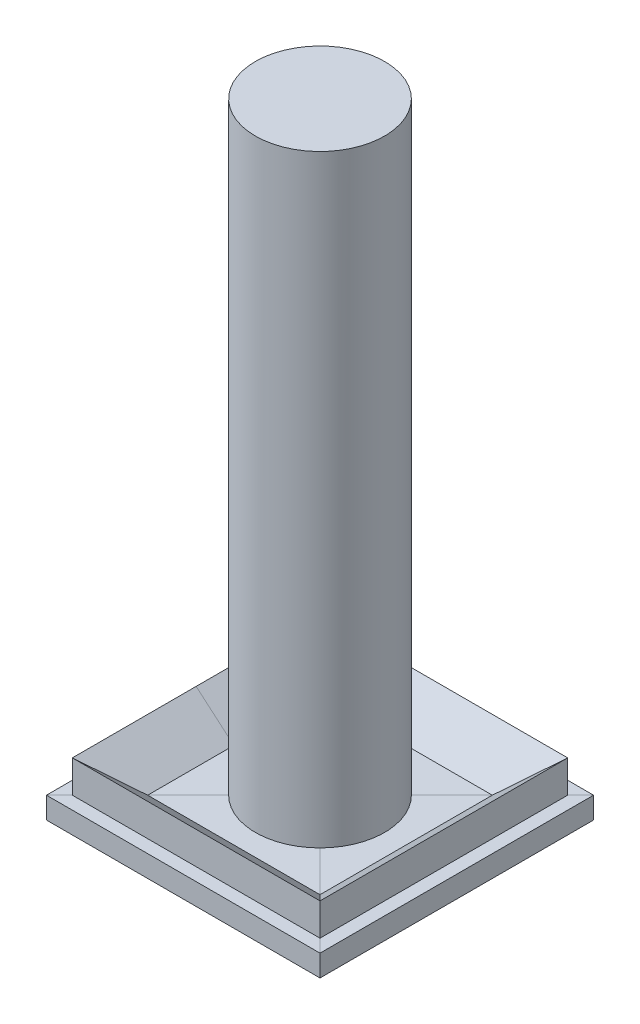
ISO-10303-21;
HEADER;
FILE_DESCRIPTION(('STEP AP214'),'2;1');
FILE_NAME('part.step','',(''),(''),'','','');
FILE_SCHEMA(('AUTOMOTIVE_DESIGN { 1 0 10303 214 1 1 1 1 }'));
ENDSEC;
DATA;
#1=APPLICATION_CONTEXT('core data for automotive mechanical design processes');
#2=APPLICATION_PROTOCOL_DEFINITION('international standard','automotive_design',2000,#1);
#3=PRODUCT_CONTEXT('',#1,'mechanical');
#4=PRODUCT('Part','Part','',(#3));
#5=PRODUCT_RELATED_PRODUCT_CATEGORY('part','',(#4));
#6=PRODUCT_DEFINITION_FORMATION('','',#4);
#7=PRODUCT_DEFINITION_CONTEXT('part definition',#1,'design');
#8=PRODUCT_DEFINITION('design','',#6,#7);
#9=PRODUCT_DEFINITION_SHAPE('','',#8);
#10=(LENGTH_UNIT() NAMED_UNIT(*) SI_UNIT(.MILLI.,.METRE.));
#11=(NAMED_UNIT(*) PLANE_ANGLE_UNIT() SI_UNIT($,.RADIAN.));
#12=(NAMED_UNIT(*) SI_UNIT($,.STERADIAN.) SOLID_ANGLE_UNIT());
#13=UNCERTAINTY_MEASURE_WITH_UNIT(LENGTH_MEASURE(1.E-05),#10,'distance_accuracy_value','');
#14=(GEOMETRIC_REPRESENTATION_CONTEXT(3) GLOBAL_UNCERTAINTY_ASSIGNED_CONTEXT((#13)) GLOBAL_UNIT_ASSIGNED_CONTEXT((#10,
#11,#12)) REPRESENTATION_CONTEXT('',''));
#15=CARTESIAN_POINT('',(0.,0.,0.));
#16=DIRECTION('',(0.,0.,1.));
#17=DIRECTION('',(1.,0.,0.));
#18=AXIS2_PLACEMENT_3D('',#15,#16,#17);
#19=CARTESIAN_POINT('',(12.7,0.,12.7));
#20=DIRECTION('',(0.,1.,0.));
#21=DIRECTION('',(0.,0.,1.));
#22=AXIS2_PLACEMENT_3D('',#19,#20,#21);
#23=PLANE('',#22);
#24=DIRECTION('',(-1.,0.,0.));
#25=VECTOR('',#24,1.);
#26=CARTESIAN_POINT('',(12.7,0.,12.7));
#27=LINE('',#26,#25);
#28=CARTESIAN_POINT('',(12.7,0.,12.7));
#29=VERTEX_POINT('',#28);
#30=CARTESIAN_POINT('',(-12.7,0.,12.7));
#31=VERTEX_POINT('',#30);
#32=EDGE_CURVE('E293',#29,#31,#27,.T.);
#33=ORIENTED_EDGE('',*,*,#32,.T.);
#34=DIRECTION('',(-0.707106781186547,0.,0.707106781186548));
#35=VECTOR('',#34,1.);
#36=CARTESIAN_POINT('',(-12.7,0.,12.7));
#37=LINE('',#36,#35);
#38=CARTESIAN_POINT('',(0.,0.,0.));
#39=VERTEX_POINT('',#38);
#40=EDGE_CURVE('E257',#39,#31,#37,.T.);
#41=ORIENTED_EDGE('',*,*,#40,.F.);
#42=DIRECTION('',(0.707106781186548,0.,0.707106781186547));
#43=VECTOR('',#42,1.);
#44=CARTESIAN_POINT('',(0.,0.,0.));
#45=LINE('',#44,#43);
#46=EDGE_CURVE('E207',#39,#29,#45,.T.);
#47=ORIENTED_EDGE('',*,*,#46,.T.);
#48=EDGE_LOOP('',(#33,#41,#47));
#49=FACE_BOUND('',#48,.T.);
#50=ADVANCED_FACE('F37',(#49),#23,.F.);
#51=CARTESIAN_POINT('',(12.7,0.,12.7));
#52=DIRECTION('',(0.,0.,-1.));
#53=DIRECTION('',(-1.,0.,0.));
#54=AXIS2_PLACEMENT_3D('',#51,#52,#53);
#55=PLANE('',#54);
#56=DIRECTION('',(0.,-1.,0.));
#57=VECTOR('',#56,1.);
#58=CARTESIAN_POINT('',(-12.7,0.,12.7));
#59=LINE('',#58,#57);
#60=CARTESIAN_POINT('',(-12.7,2.,12.7));
#61=VERTEX_POINT('',#60);
#62=EDGE_CURVE('E272',#61,#31,#59,.T.);
#63=ORIENTED_EDGE('',*,*,#62,.T.);
#64=ORIENTED_EDGE('',*,*,#32,.F.);
#65=DIRECTION('',(0.,-1.,0.));
#66=VECTOR('',#65,1.);
#67=CARTESIAN_POINT('',(12.7,0.,12.7));
#68=LINE('',#67,#66);
#69=CARTESIAN_POINT('',(12.7,2.,12.7));
#70=VERTEX_POINT('',#69);
#71=EDGE_CURVE('E228',#70,#29,#68,.T.);
#72=ORIENTED_EDGE('',*,*,#71,.F.);
#73=DIRECTION('',(-1.,0.,0.));
#74=VECTOR('',#73,1.);
#75=CARTESIAN_POINT('',(12.7,2.,12.7));
#76=LINE('',#75,#74);
#77=EDGE_CURVE('E177',#70,#61,#76,.T.);
#78=ORIENTED_EDGE('',*,*,#77,.T.);
#79=EDGE_LOOP('',(#63,#64,#72,#78));
#80=FACE_BOUND('',#79,.T.);
#81=ADVANCED_FACE('F417',(#80),#55,.F.);
#82=CARTESIAN_POINT('',(12.7,2.,12.7));
#83=DIRECTION('',(0.,-1.,0.));
#84=DIRECTION('',(0.,0.,-1.));
#85=AXIS2_PLACEMENT_3D('',#82,#83,#84);
#86=PLANE('',#85);
#87=ORIENTED_EDGE('',*,*,#77,.F.);
#88=DIRECTION('',(-0.707106781186548,0.,-0.707106781186547));
#89=VECTOR('',#88,1.);
#90=CARTESIAN_POINT('',(0.,2.,0.));
#91=LINE('',#90,#89);
#92=CARTESIAN_POINT('',(11.5,2.,11.5));
#93=VERTEX_POINT('',#92);
#94=EDGE_CURVE('E225',#70,#93,#91,.T.);
#95=ORIENTED_EDGE('',*,*,#94,.T.);
#96=DIRECTION('',(-1.,0.,0.));
#97=VECTOR('',#96,1.);
#98=CARTESIAN_POINT('',(12.7,2.,11.5));
#99=LINE('',#98,#97);
#100=CARTESIAN_POINT('',(-11.5,2.,11.5));
#101=VERTEX_POINT('',#100);
#102=EDGE_CURVE('E305',#93,#101,#99,.T.);
#103=ORIENTED_EDGE('',*,*,#102,.T.);
#104=DIRECTION('',(0.707106781186547,0.,-0.707106781186548));
#105=VECTOR('',#104,1.);
#106=CARTESIAN_POINT('',(-12.7,2.,12.7));
#107=LINE('',#106,#105);
#108=EDGE_CURVE('E232',#61,#101,#107,.T.);
#109=ORIENTED_EDGE('',*,*,#108,.F.);
#110=EDGE_LOOP('',(#87,#95,#103,#109));
#111=FACE_BOUND('',#110,.T.);
#112=ADVANCED_FACE('F39',(#111),#86,.F.);
#113=CARTESIAN_POINT('',(12.7,2.,11.5));
#114=DIRECTION('',(0.,0.,-1.));
#115=DIRECTION('',(0.,1.,0.));
#116=AXIS2_PLACEMENT_3D('',#113,#114,#115);
#117=PLANE('',#116);
#118=ORIENTED_EDGE('',*,*,#102,.F.);
#119=DIRECTION('',(0.,1.,0.));
#120=VECTOR('',#119,1.);
#121=CARTESIAN_POINT('',(11.5,2.00000000000003,11.5));
#122=LINE('',#121,#120);
#123=CARTESIAN_POINT('',(11.5,5.,11.5));
#124=VERTEX_POINT('',#123);
#125=EDGE_CURVE('E222',#93,#124,#122,.T.);
#126=ORIENTED_EDGE('',*,*,#125,.T.);
#127=DIRECTION('',(-1.,0.,0.));
#128=VECTOR('',#127,1.);
#129=CARTESIAN_POINT('',(12.7,5.,11.5));
#130=LINE('',#129,#128);
#131=CARTESIAN_POINT('',(-11.5,5.,11.5));
#132=VERTEX_POINT('',#131);
#133=EDGE_CURVE('E311',#124,#132,#130,.T.);
#134=ORIENTED_EDGE('',*,*,#133,.T.);
#135=DIRECTION('',(0.,1.,0.));
#136=VECTOR('',#135,1.);
#137=CARTESIAN_POINT('',(-11.5,2.,11.5));
#138=LINE('',#137,#136);
#139=EDGE_CURVE('E264',#101,#132,#138,.T.);
#140=ORIENTED_EDGE('',*,*,#139,.F.);
#141=EDGE_LOOP('',(#118,#126,#134,#140));
#142=FACE_BOUND('',#141,.T.);
#143=ADVANCED_FACE('F343',(#142),#117,.F.);
#144=CARTESIAN_POINT('',(12.7,5.,11.5));
#145=DIRECTION('',(0.,-0.759256602365297,0.650791373455968));
#146=DIRECTION('',(0.,-0.650791373455968,-0.759256602365297));
#147=AXIS2_PLACEMENT_3D('',#144,#145,#146);
#148=PLANE('',#147);
#149=ORIENTED_EDGE('',*,*,#133,.F.);
#150=DIRECTION('',(-0.604707897906952,-0.518321055348816,-0.604707897906952));
#151=VECTOR('',#150,1.);
#152=CARTESIAN_POINT('',(2.65074626865671,-2.58507462686567,2.65074626865671));
#153=LINE('',#152,#151);
#154=CARTESIAN_POINT('',(8.,2.,7.99999999999999));
#155=VERTEX_POINT('',#154);
#156=EDGE_CURVE('E218',#124,#155,#153,.T.);
#157=ORIENTED_EDGE('',*,*,#156,.T.);
#158=DIRECTION('',(-1.,0.,0.));
#159=VECTOR('',#158,1.);
#160=CARTESIAN_POINT('',(12.7,2.,7.99999999999999));
#161=LINE('',#160,#159);
#162=CARTESIAN_POINT('',(-8.,2.,8.));
#163=VERTEX_POINT('',#162);
#164=EDGE_CURVE('E308',#155,#163,#161,.T.);
#165=ORIENTED_EDGE('',*,*,#164,.T.);
#166=DIRECTION('',(0.604707897906952,-0.518321055348816,-0.604707897906952));
#167=VECTOR('',#166,1.);
#168=CARTESIAN_POINT('',(-11.9388059701493,5.37611940298507,11.9388059701493));
#169=LINE('',#168,#167);
#170=EDGE_CURVE('E262',#132,#163,#169,.T.);
#171=ORIENTED_EDGE('',*,*,#170,.F.);
#172=EDGE_LOOP('',(#149,#157,#165,#171));
#173=FACE_BOUND('',#172,.T.);
#174=ADVANCED_FACE('F318',(#173),#148,.F.);
#175=CARTESIAN_POINT('',(12.7,2.,7.99999999999999));
#176=DIRECTION('',(0.,-1.,0.));
#177=DIRECTION('',(0.,0.,-1.));
#178=AXIS2_PLACEMENT_3D('',#175,#176,#177);
#179=PLANE('',#178);
#180=CARTESIAN_POINT('',(0.,2.,0.));
#181=DIRECTION('',(0.,-1.,0.));
#182=DIRECTION('',(0.,0.,-1.));
#183=AXIS2_PLACEMENT_3D('',#180,#181,#182);
#184=CIRCLE('',#183,6.);
#185=CARTESIAN_POINT('',(-4.24264068711929,2.,4.24264068711928));
#186=VERTEX_POINT('',#185);
#187=CARTESIAN_POINT('',(4.24264068711929,2.,4.24264068711928));
#188=VERTEX_POINT('',#187);
#189=EDGE_CURVE('E52',#186,#188,#184,.F.);
#190=ORIENTED_EDGE('',*,*,#189,.F.);
#191=DIRECTION('',(0.707106781186547,0.,-0.707106781186548));
#192=VECTOR('',#191,1.);
#193=CARTESIAN_POINT('',(-10.35,2.,10.35));
#194=LINE('',#193,#192);
#195=EDGE_CURVE('E259',#163,#186,#194,.T.);
#196=ORIENTED_EDGE('',*,*,#195,.F.);
#197=ORIENTED_EDGE('',*,*,#164,.F.);
#198=DIRECTION('',(-0.707106781186548,0.,-0.707106781186547));
#199=VECTOR('',#198,1.);
#200=CARTESIAN_POINT('',(-2.35,2.,-2.35));
#201=LINE('',#200,#199);
#202=EDGE_CURVE('E216',#155,#188,#201,.T.);
#203=ORIENTED_EDGE('',*,*,#202,.T.);
#204=EDGE_LOOP('',(#190,#196,#197,#203));
#205=FACE_BOUND('',#204,.T.);
#206=ADVANCED_FACE('F321',(#205),#179,.F.);
#207=CARTESIAN_POINT('',(-12.7,0.,12.7));
#208=DIRECTION('',(0.,1.,0.));
#209=DIRECTION('',(0.,0.,1.));
#210=AXIS2_PLACEMENT_3D('',#207,#208,#209);
#211=PLANE('',#210);
#212=DIRECTION('',(1.,0.,0.));
#213=VECTOR('',#212,1.);
#214=CARTESIAN_POINT('',(-12.7,0.,0.));
#215=LINE('',#214,#213);
#216=CARTESIAN_POINT('',(-12.7,0.,0.));
#217=VERTEX_POINT('',#216);
#218=EDGE_CURVE('E267',#217,#39,#215,.T.);
#219=ORIENTED_EDGE('',*,*,#218,.T.);
#220=ORIENTED_EDGE('',*,*,#40,.T.);
#221=DIRECTION('',(0.,0.,-1.));
#222=VECTOR('',#221,1.);
#223=CARTESIAN_POINT('',(-12.7,0.,12.7));
#224=LINE('',#223,#222);
#225=EDGE_CURVE('E269',#31,#217,#224,.T.);
#226=ORIENTED_EDGE('',*,*,#225,.T.);
#227=EDGE_LOOP('',(#219,#220,#226));
#228=FACE_BOUND('',#227,.T.);
#229=ADVANCED_FACE('F421',(#228),#211,.F.);
#230=CARTESIAN_POINT('',(-8.,2.,12.7));
#231=DIRECTION('',(0.,-1.,0.));
#232=DIRECTION('',(1.,0.,0.));
#233=AXIS2_PLACEMENT_3D('',#230,#231,#232);
#234=PLANE('',#233);
#235=CARTESIAN_POINT('',(0.,2.,0.));
#236=DIRECTION('',(0.,-1.,0.));
#237=DIRECTION('',(1.,0.,0.));
#238=AXIS2_PLACEMENT_3D('',#235,#236,#237);
#239=CIRCLE('',#238,6.);
#240=CARTESIAN_POINT('',(-6.,2.,0.));
#241=VERTEX_POINT('',#240);
#242=EDGE_CURVE('E59',#241,#186,#239,.F.);
#243=ORIENTED_EDGE('',*,*,#242,.F.);
#244=DIRECTION('',(-1.,0.,0.));
#245=VECTOR('',#244,1.);
#246=CARTESIAN_POINT('',(-8.,2.,0.));
#247=LINE('',#246,#245);
#248=CARTESIAN_POINT('',(-8.,2.,0.));
#249=VERTEX_POINT('',#248);
#250=EDGE_CURVE('E163',#241,#249,#247,.T.);
#251=ORIENTED_EDGE('',*,*,#250,.T.);
#252=DIRECTION('',(0.,0.,-1.));
#253=VECTOR('',#252,1.);
#254=CARTESIAN_POINT('',(-8.,2.,12.7));
#255=LINE('',#254,#253);
#256=EDGE_CURVE('E247',#163,#249,#255,.T.);
#257=ORIENTED_EDGE('',*,*,#256,.F.);
#258=ORIENTED_EDGE('',*,*,#195,.T.);
#259=EDGE_LOOP('',(#243,#251,#257,#258));
#260=FACE_BOUND('',#259,.T.);
#261=ADVANCED_FACE('F322',(#260),#234,.F.);
#262=CARTESIAN_POINT('',(-11.5,5.,12.7));
#263=DIRECTION('',(-0.650791373455968,-0.759256602365297,0.));
#264=DIRECTION('',(0.759256602365297,-0.650791373455968,0.));
#265=AXIS2_PLACEMENT_3D('',#262,#263,#264);
#266=PLANE('',#265);
#267=ORIENTED_EDGE('',*,*,#170,.T.);
#268=ORIENTED_EDGE('',*,*,#256,.T.);
#269=DIRECTION('',(-0.759256602365297,0.650791373455968,0.));
#270=VECTOR('',#269,1.);
#271=CARTESIAN_POINT('',(-11.5,5.,0.));
#272=LINE('',#271,#270);
#273=CARTESIAN_POINT('',(-11.5,5.,0.));
#274=VERTEX_POINT('',#273);
#275=EDGE_CURVE('E250',#249,#274,#272,.T.);
#276=ORIENTED_EDGE('',*,*,#275,.T.);
#277=DIRECTION('',(0.,0.,-1.));
#278=VECTOR('',#277,1.);
#279=CARTESIAN_POINT('',(-11.5,5.,12.7));
#280=LINE('',#279,#278);
#281=EDGE_CURVE('E251',#132,#274,#280,.T.);
#282=ORIENTED_EDGE('',*,*,#281,.F.);
#283=EDGE_LOOP('',(#267,#268,#276,#282));
#284=FACE_BOUND('',#283,.T.);
#285=ADVANCED_FACE('F324',(#284),#266,.F.);
#286=CARTESIAN_POINT('',(-11.5,2.,12.7));
#287=DIRECTION('',(1.,0.,0.));
#288=DIRECTION('',(0.,1.,0.));
#289=AXIS2_PLACEMENT_3D('',#286,#287,#288);
#290=PLANE('',#289);
#291=ORIENTED_EDGE('',*,*,#139,.T.);
#292=ORIENTED_EDGE('',*,*,#281,.T.);
#293=DIRECTION('',(0.,-1.,0.));
#294=VECTOR('',#293,1.);
#295=CARTESIAN_POINT('',(-11.5,2.,0.));
#296=LINE('',#295,#294);
#297=CARTESIAN_POINT('',(-11.5,2.,0.));
#298=VERTEX_POINT('',#297);
#299=EDGE_CURVE('E253',#274,#298,#296,.T.);
#300=ORIENTED_EDGE('',*,*,#299,.T.);
#301=DIRECTION('',(0.,0.,-1.));
#302=VECTOR('',#301,1.);
#303=CARTESIAN_POINT('',(-11.5,2.,12.7));
#304=LINE('',#303,#302);
#305=EDGE_CURVE('E254',#101,#298,#304,.T.);
#306=ORIENTED_EDGE('',*,*,#305,.F.);
#307=EDGE_LOOP('',(#291,#292,#300,#306));
#308=FACE_BOUND('',#307,.T.);
#309=ADVANCED_FACE('F339',(#308),#290,.F.);
#310=CARTESIAN_POINT('',(-12.7,2.,12.7));
#311=DIRECTION('',(0.,-1.,0.));
#312=DIRECTION('',(0.,0.,-1.));
#313=AXIS2_PLACEMENT_3D('',#310,#311,#312);
#314=PLANE('',#313);
#315=ORIENTED_EDGE('',*,*,#108,.T.);
#316=ORIENTED_EDGE('',*,*,#305,.T.);
#317=DIRECTION('',(-1.,0.,0.));
#318=VECTOR('',#317,1.);
#319=CARTESIAN_POINT('',(-12.7,2.,0.));
#320=LINE('',#319,#318);
#321=CARTESIAN_POINT('',(-12.7,2.,0.));
#322=VERTEX_POINT('',#321);
#323=EDGE_CURVE('E256',#298,#322,#320,.T.);
#324=ORIENTED_EDGE('',*,*,#323,.T.);
#325=DIRECTION('',(0.,0.,-1.));
#326=VECTOR('',#325,1.);
#327=CARTESIAN_POINT('',(-12.7,2.,12.7));
#328=LINE('',#327,#326);
#329=EDGE_CURVE('E285',#61,#322,#328,.T.);
#330=ORIENTED_EDGE('',*,*,#329,.F.);
#331=EDGE_LOOP('',(#315,#316,#324,#330));
#332=FACE_BOUND('',#331,.T.);
#333=ADVANCED_FACE('F540',(#332),#314,.F.);
#334=CARTESIAN_POINT('',(-12.7,0.,12.7));
#335=DIRECTION('',(1.,0.,0.));
#336=DIRECTION('',(0.,0.,-1.));
#337=AXIS2_PLACEMENT_3D('',#334,#335,#336);
#338=PLANE('',#337);
#339=DIRECTION('',(0.,-1.,0.));
#340=VECTOR('',#339,1.);
#341=CARTESIAN_POINT('',(-12.7,0.,0.));
#342=LINE('',#341,#340);
#343=EDGE_CURVE('E277',#322,#217,#342,.T.);
#344=ORIENTED_EDGE('',*,*,#343,.T.);
#345=ORIENTED_EDGE('',*,*,#225,.F.);
#346=ORIENTED_EDGE('',*,*,#62,.F.);
#347=ORIENTED_EDGE('',*,*,#329,.T.);
#348=EDGE_LOOP('',(#344,#345,#346,#347));
#349=FACE_BOUND('',#348,.T.);
#350=ADVANCED_FACE('F534',(#349),#338,.F.);
#351=CARTESIAN_POINT('',(-12.7,0.,0.));
#352=DIRECTION('',(1.,0.,0.));
#353=DIRECTION('',(0.,0.,-1.));
#354=AXIS2_PLACEMENT_3D('',#351,#352,#353);
#355=PLANE('',#354);
#356=DIRECTION('',(0.,-1.,0.));
#357=VECTOR('',#356,1.);
#358=CARTESIAN_POINT('',(-12.7,0.,-12.7));
#359=LINE('',#358,#357);
#360=CARTESIAN_POINT('',(-12.7,2.,-12.7));
#361=VERTEX_POINT('',#360);
#362=CARTESIAN_POINT('',(-12.7,0.,-12.7));
#363=VERTEX_POINT('',#362);
#364=EDGE_CURVE('E194',#361,#363,#359,.T.);
#365=ORIENTED_EDGE('',*,*,#364,.T.);
#366=DIRECTION('',(0.,0.,-1.));
#367=VECTOR('',#366,1.);
#368=CARTESIAN_POINT('',(-12.7,0.,0.));
#369=LINE('',#368,#367);
#370=EDGE_CURVE('E273',#217,#363,#369,.T.);
#371=ORIENTED_EDGE('',*,*,#370,.F.);
#372=ORIENTED_EDGE('',*,*,#343,.F.);
#373=DIRECTION('',(0.,0.,-1.));
#374=VECTOR('',#373,1.);
#375=CARTESIAN_POINT('',(-12.7,2.,0.));
#376=LINE('',#375,#374);
#377=EDGE_CURVE('E260',#322,#361,#376,.T.);
#378=ORIENTED_EDGE('',*,*,#377,.T.);
#379=EDGE_LOOP('',(#365,#371,#372,#378));
#380=FACE_BOUND('',#379,.T.);
#381=ADVANCED_FACE('F427',(#380),#355,.F.);
#382=CARTESIAN_POINT('',(-12.7,0.,0.));
#383=DIRECTION('',(0.,1.,0.));
#384=DIRECTION('',(0.,0.,1.));
#385=AXIS2_PLACEMENT_3D('',#382,#383,#384);
#386=PLANE('',#385);
#387=ORIENTED_EDGE('',*,*,#370,.T.);
#388=DIRECTION('',(-0.707106781186548,0.,-0.707106781186547));
#389=VECTOR('',#388,1.);
#390=CARTESIAN_POINT('',(-12.7,0.,-12.7));
#391=LINE('',#390,#389);
#392=EDGE_CURVE('E157',#39,#363,#391,.T.);
#393=ORIENTED_EDGE('',*,*,#392,.F.);
#394=ORIENTED_EDGE('',*,*,#218,.F.);
#395=EDGE_LOOP('',(#387,#393,#394));
#396=FACE_BOUND('',#395,.T.);
#397=ADVANCED_FACE('F424',(#396),#386,.F.);
#398=CARTESIAN_POINT('',(-8.,2.,0.));
#399=DIRECTION('',(0.,-1.,0.));
#400=DIRECTION('',(1.,0.,0.));
#401=AXIS2_PLACEMENT_3D('',#398,#399,#400);
#402=PLANE('',#401);
#403=CARTESIAN_POINT('',(0.,2.,0.));
#404=DIRECTION('',(0.,-1.,0.));
#405=DIRECTION('',(1.,0.,0.));
#406=AXIS2_PLACEMENT_3D('',#403,#404,#405);
#407=CIRCLE('',#406,6.);
#408=CARTESIAN_POINT('',(-4.24264068711928,2.,-4.24264068711929));
#409=VERTEX_POINT('',#408);
#410=EDGE_CURVE('E161',#409,#241,#407,.F.);
#411=ORIENTED_EDGE('',*,*,#410,.F.);
#412=DIRECTION('',(0.707106781186548,0.,0.707106781186547));
#413=VECTOR('',#412,1.);
#414=CARTESIAN_POINT('',(-10.35,2.,-10.35));
#415=LINE('',#414,#413);
#416=CARTESIAN_POINT('',(-8.,2.,-8.));
#417=VERTEX_POINT('',#416);
#418=EDGE_CURVE('E149',#417,#409,#415,.T.);
#419=ORIENTED_EDGE('',*,*,#418,.F.);
#420=DIRECTION('',(0.,0.,-1.));
#421=VECTOR('',#420,1.);
#422=CARTESIAN_POINT('',(-8.,2.,0.));
#423=LINE('',#422,#421);
#424=EDGE_CURVE('E276',#249,#417,#423,.T.);
#425=ORIENTED_EDGE('',*,*,#424,.F.);
#426=ORIENTED_EDGE('',*,*,#250,.F.);
#427=EDGE_LOOP('',(#411,#419,#425,#426));
#428=FACE_BOUND('',#427,.T.);
#429=ADVANCED_FACE('F162',(#428),#402,.F.);
#430=CARTESIAN_POINT('',(-11.5,5.,0.));
#431=DIRECTION('',(-0.650791373455968,-0.759256602365297,0.));
#432=DIRECTION('',(0.759256602365297,-0.650791373455968,0.));
#433=AXIS2_PLACEMENT_3D('',#430,#431,#432);
#434=PLANE('',#433);
#435=DIRECTION('',(0.,0.,-1.));
#436=VECTOR('',#435,1.);
#437=CARTESIAN_POINT('',(-11.5,5.,0.));
#438=LINE('',#437,#436);
#439=CARTESIAN_POINT('',(-11.5,5.,-11.5));
#440=VERTEX_POINT('',#439);
#441=EDGE_CURVE('E298',#274,#440,#438,.T.);
#442=ORIENTED_EDGE('',*,*,#441,.F.);
#443=ORIENTED_EDGE('',*,*,#275,.F.);
#444=ORIENTED_EDGE('',*,*,#424,.T.);
#445=DIRECTION('',(0.604707897906952,-0.518321055348816,0.604707897906952));
#446=VECTOR('',#445,1.);
#447=CARTESIAN_POINT('',(-11.9388059701493,5.37611940298507,-11.9388059701493));
#448=LINE('',#447,#446);
#449=EDGE_CURVE('E158',#440,#417,#448,.T.);
#450=ORIENTED_EDGE('',*,*,#449,.F.);
#451=EDGE_LOOP('',(#442,#443,#444,#450));
#452=FACE_BOUND('',#451,.T.);
#453=ADVANCED_FACE('F329',(#452),#434,.F.);
#454=CARTESIAN_POINT('',(-11.5,2.,0.));
#455=DIRECTION('',(1.,0.,0.));
#456=DIRECTION('',(0.,1.,0.));
#457=AXIS2_PLACEMENT_3D('',#454,#455,#456);
#458=PLANE('',#457);
#459=DIRECTION('',(0.,0.,-1.));
#460=VECTOR('',#459,1.);
#461=CARTESIAN_POINT('',(-11.5,2.,0.));
#462=LINE('',#461,#460);
#463=CARTESIAN_POINT('',(-11.5,2.,-11.5));
#464=VERTEX_POINT('',#463);
#465=EDGE_CURVE('E290',#298,#464,#462,.T.);
#466=ORIENTED_EDGE('',*,*,#465,.F.);
#467=ORIENTED_EDGE('',*,*,#299,.F.);
#468=ORIENTED_EDGE('',*,*,#441,.T.);
#469=DIRECTION('',(0.,1.,0.));
#470=VECTOR('',#469,1.);
#471=CARTESIAN_POINT('',(-11.5,2.,-11.5));
#472=LINE('',#471,#470);
#473=EDGE_CURVE('E206',#464,#440,#472,.T.);
#474=ORIENTED_EDGE('',*,*,#473,.F.);
#475=EDGE_LOOP('',(#466,#467,#468,#474));
#476=FACE_BOUND('',#475,.T.);
#477=ADVANCED_FACE('F335',(#476),#458,.F.);
#478=CARTESIAN_POINT('',(-12.7,2.,0.));
#479=DIRECTION('',(0.,-1.,0.));
#480=DIRECTION('',(0.,0.,-1.));
#481=AXIS2_PLACEMENT_3D('',#478,#479,#480);
#482=PLANE('',#481);
#483=ORIENTED_EDGE('',*,*,#377,.F.);
#484=ORIENTED_EDGE('',*,*,#323,.F.);
#485=ORIENTED_EDGE('',*,*,#465,.T.);
#486=DIRECTION('',(0.707106781186548,0.,0.707106781186547));
#487=VECTOR('',#486,1.);
#488=CARTESIAN_POINT('',(-12.7,2.,-12.7));
#489=LINE('',#488,#487);
#490=EDGE_CURVE('E204',#361,#464,#489,.T.);
#491=ORIENTED_EDGE('',*,*,#490,.F.);
#492=EDGE_LOOP('',(#483,#484,#485,#491));
#493=FACE_BOUND('',#492,.T.);
#494=ADVANCED_FACE('F390',(#493),#482,.F.);
#495=CARTESIAN_POINT('',(12.7,0.,-12.7));
#496=DIRECTION('',(0.,1.,0.));
#497=DIRECTION('',(0.,0.,1.));
#498=AXIS2_PLACEMENT_3D('',#495,#496,#497);
#499=PLANE('',#498);
#500=DIRECTION('',(0.,0.,1.));
#501=VECTOR('',#500,1.);
#502=CARTESIAN_POINT('',(12.7,0.,-12.7));
#503=LINE('',#502,#501);
#504=CARTESIAN_POINT('',(12.7,0.,-12.7));
#505=VERTEX_POINT('',#504);
#506=EDGE_CURVE('E219',#505,#29,#503,.T.);
#507=ORIENTED_EDGE('',*,*,#506,.T.);
#508=ORIENTED_EDGE('',*,*,#46,.F.);
#509=DIRECTION('',(0.707106781186547,0.,-0.707106781186548));
#510=VECTOR('',#509,1.);
#511=CARTESIAN_POINT('',(0.,0.,0.));
#512=LINE('',#511,#510);
#513=EDGE_CURVE('E178',#39,#505,#512,.T.);
#514=ORIENTED_EDGE('',*,*,#513,.T.);
#515=EDGE_LOOP('',(#507,#508,#514));
#516=FACE_BOUND('',#515,.T.);
#517=ADVANCED_FACE('F388',(#516),#499,.F.);
#518=CARTESIAN_POINT('',(12.7,0.,-12.7));
#519=DIRECTION('',(-1.,0.,0.));
#520=DIRECTION('',(0.,0.,1.));
#521=AXIS2_PLACEMENT_3D('',#518,#519,#520);
#522=PLANE('',#521);
#523=ORIENTED_EDGE('',*,*,#71,.T.);
#524=ORIENTED_EDGE('',*,*,#506,.F.);
#525=DIRECTION('',(0.,-1.,0.));
#526=VECTOR('',#525,1.);
#527=CARTESIAN_POINT('',(12.7,0.,-12.7));
#528=LINE('',#527,#526);
#529=CARTESIAN_POINT('',(12.7,2.,-12.7));
#530=VERTEX_POINT('',#529);
#531=EDGE_CURVE('E181',#530,#505,#528,.T.);
#532=ORIENTED_EDGE('',*,*,#531,.F.);
#533=DIRECTION('',(0.,0.,1.));
#534=VECTOR('',#533,1.);
#535=CARTESIAN_POINT('',(12.7,2.,-12.7));
#536=LINE('',#535,#534);
#537=EDGE_CURVE('E231',#530,#70,#536,.T.);
#538=ORIENTED_EDGE('',*,*,#537,.T.);
#539=EDGE_LOOP('',(#523,#524,#532,#538));
#540=FACE_BOUND('',#539,.T.);
#541=ADVANCED_FACE('F385',(#540),#522,.F.);
#542=CARTESIAN_POINT('',(12.7,2.,-12.7));
#543=DIRECTION('',(0.,-1.,0.));
#544=DIRECTION('',(0.,0.,-1.));
#545=AXIS2_PLACEMENT_3D('',#542,#543,#544);
#546=PLANE('',#545);
#547=ORIENTED_EDGE('',*,*,#537,.F.);
#548=DIRECTION('',(-0.707106781186547,0.,0.707106781186548));
#549=VECTOR('',#548,1.);
#550=CARTESIAN_POINT('',(0.,2.,0.));
#551=LINE('',#550,#549);
#552=CARTESIAN_POINT('',(11.5,2.,-11.5));
#553=VERTEX_POINT('',#552);
#554=EDGE_CURVE('E45',#530,#553,#551,.T.);
#555=ORIENTED_EDGE('',*,*,#554,.T.);
#556=DIRECTION('',(0.,0.,1.));
#557=VECTOR('',#556,1.);
#558=CARTESIAN_POINT('',(11.5,2.,-12.7));
#559=LINE('',#558,#557);
#560=EDGE_CURVE('E235',#553,#93,#559,.T.);
#561=ORIENTED_EDGE('',*,*,#560,.T.);
#562=ORIENTED_EDGE('',*,*,#94,.F.);
#563=EDGE_LOOP('',(#547,#555,#561,#562));
#564=FACE_BOUND('',#563,.T.);
#565=ADVANCED_FACE('F387',(#564),#546,.F.);
#566=CARTESIAN_POINT('',(11.5,2.,-12.7));
#567=DIRECTION('',(-1.,0.,0.));
#568=DIRECTION('',(0.,-1.,0.));
#569=AXIS2_PLACEMENT_3D('',#566,#567,#568);
#570=PLANE('',#569);
#571=ORIENTED_EDGE('',*,*,#560,.F.);
#572=DIRECTION('',(0.,1.,0.));
#573=VECTOR('',#572,1.);
#574=CARTESIAN_POINT('',(11.5,2.00000000000003,-11.5));
#575=LINE('',#574,#573);
#576=CARTESIAN_POINT('',(11.5,5.,-11.5));
#577=VERTEX_POINT('',#576);
#578=EDGE_CURVE('E186',#553,#577,#575,.T.);
#579=ORIENTED_EDGE('',*,*,#578,.T.);
#580=DIRECTION('',(0.,0.,1.));
#581=VECTOR('',#580,1.);
#582=CARTESIAN_POINT('',(11.5,5.,-12.7));
#583=LINE('',#582,#581);
#584=EDGE_CURVE('E241',#577,#124,#583,.T.);
#585=ORIENTED_EDGE('',*,*,#584,.T.);
#586=ORIENTED_EDGE('',*,*,#125,.F.);
#587=EDGE_LOOP('',(#571,#579,#585,#586));
#588=FACE_BOUND('',#587,.T.);
#589=ADVANCED_FACE('F347',(#588),#570,.F.);
#590=CARTESIAN_POINT('',(11.5,5.,-12.7));
#591=DIRECTION('',(0.650791373455968,-0.759256602365297,0.));
#592=DIRECTION('',(0.759256602365297,0.650791373455968,0.));
#593=AXIS2_PLACEMENT_3D('',#590,#591,#592);
#594=PLANE('',#593);
#595=ORIENTED_EDGE('',*,*,#584,.F.);
#596=DIRECTION('',(-0.604707897906952,-0.518321055348816,0.604707897906952));
#597=VECTOR('',#596,1.);
#598=CARTESIAN_POINT('',(2.65074626865671,-2.58507462686567,-2.65074626865672));
#599=LINE('',#598,#597);
#600=CARTESIAN_POINT('',(8.,2.,-8.));
#601=VERTEX_POINT('',#600);
#602=EDGE_CURVE('E183',#577,#601,#599,.T.);
#603=ORIENTED_EDGE('',*,*,#602,.T.);
#604=DIRECTION('',(0.,0.,1.));
#605=VECTOR('',#604,1.);
#606=CARTESIAN_POINT('',(8.,2.,-12.7));
#607=LINE('',#606,#605);
#608=EDGE_CURVE('E238',#601,#155,#607,.T.);
#609=ORIENTED_EDGE('',*,*,#608,.T.);
#610=ORIENTED_EDGE('',*,*,#156,.F.);
#611=EDGE_LOOP('',(#595,#603,#609,#610));
#612=FACE_BOUND('',#611,.T.);
#613=ADVANCED_FACE('F349',(#612),#594,.F.);
#614=CARTESIAN_POINT('',(8.,2.,-12.7));
#615=DIRECTION('',(0.,-1.,0.));
#616=DIRECTION('',(1.,0.,0.));
#617=AXIS2_PLACEMENT_3D('',#614,#615,#616);
#618=PLANE('',#617);
#619=CARTESIAN_POINT('',(0.,2.,0.));
#620=DIRECTION('',(0.,-1.,0.));
#621=DIRECTION('',(1.,0.,0.));
#622=AXIS2_PLACEMENT_3D('',#619,#620,#621);
#623=CIRCLE('',#622,6.);
#624=CARTESIAN_POINT('',(4.24264068711928,2.,-4.24264068711929));
#625=VERTEX_POINT('',#624);
#626=EDGE_CURVE('E165',#188,#625,#623,.F.);
#627=ORIENTED_EDGE('',*,*,#626,.F.);
#628=ORIENTED_EDGE('',*,*,#202,.F.);
#629=ORIENTED_EDGE('',*,*,#608,.F.);
#630=DIRECTION('',(-0.707106781186547,0.,0.707106781186548));
#631=VECTOR('',#630,1.);
#632=CARTESIAN_POINT('',(-2.35,2.,2.34999999999999));
#633=LINE('',#632,#631);
#634=EDGE_CURVE('E180',#601,#625,#633,.T.);
#635=ORIENTED_EDGE('',*,*,#634,.T.);
#636=EDGE_LOOP('',(#627,#628,#629,#635));
#637=FACE_BOUND('',#636,.T.);
#638=ADVANCED_FACE('F351',(#637),#618,.F.);
#639=CARTESIAN_POINT('',(-12.7,0.,-12.7));
#640=DIRECTION('',(0.,0.,1.));
#641=DIRECTION('',(1.,0.,0.));
#642=AXIS2_PLACEMENT_3D('',#639,#640,#641);
#643=PLANE('',#642);
#644=ORIENTED_EDGE('',*,*,#531,.T.);
#645=DIRECTION('',(1.,0.,0.));
#646=VECTOR('',#645,1.);
#647=CARTESIAN_POINT('',(-12.7,0.,-12.7));
#648=LINE('',#647,#646);
#649=EDGE_CURVE('E191',#363,#505,#648,.T.);
#650=ORIENTED_EDGE('',*,*,#649,.F.);
#651=ORIENTED_EDGE('',*,*,#364,.F.);
#652=DIRECTION('',(1.,0.,0.));
#653=VECTOR('',#652,1.);
#654=CARTESIAN_POINT('',(-12.7,2.,-12.7));
#655=LINE('',#654,#653);
#656=EDGE_CURVE('E195',#361,#530,#655,.T.);
#657=ORIENTED_EDGE('',*,*,#656,.T.);
#658=EDGE_LOOP('',(#644,#650,#651,#657));
#659=FACE_BOUND('',#658,.T.);
#660=ADVANCED_FACE('F353',(#659),#643,.F.);
#661=CARTESIAN_POINT('',(-12.7,0.,-12.7));
#662=DIRECTION('',(0.,1.,0.));
#663=DIRECTION('',(0.,0.,1.));
#664=AXIS2_PLACEMENT_3D('',#661,#662,#663);
#665=PLANE('',#664);
#666=ORIENTED_EDGE('',*,*,#649,.T.);
#667=ORIENTED_EDGE('',*,*,#513,.F.);
#668=ORIENTED_EDGE('',*,*,#392,.T.);
#669=EDGE_LOOP('',(#666,#667,#668));
#670=FACE_BOUND('',#669,.T.);
#671=ADVANCED_FACE('F360',(#670),#665,.F.);
#672=CARTESIAN_POINT('',(-12.7,2.,-8.));
#673=DIRECTION('',(0.,-1.,0.));
#674=DIRECTION('',(0.,0.,-1.));
#675=AXIS2_PLACEMENT_3D('',#672,#673,#674);
#676=PLANE('',#675);
#677=CARTESIAN_POINT('',(0.,2.,0.));
#678=DIRECTION('',(0.,-1.,0.));
#679=DIRECTION('',(0.,0.,-1.));
#680=AXIS2_PLACEMENT_3D('',#677,#678,#679);
#681=CIRCLE('',#680,6.);
#682=EDGE_CURVE('E11',#625,#409,#681,.F.);
#683=ORIENTED_EDGE('',*,*,#682,.F.);
#684=ORIENTED_EDGE('',*,*,#634,.F.);
#685=DIRECTION('',(1.,0.,0.));
#686=VECTOR('',#685,1.);
#687=CARTESIAN_POINT('',(-12.7,2.,-8.));
#688=LINE('',#687,#686);
#689=EDGE_CURVE('E154',#417,#601,#688,.T.);
#690=ORIENTED_EDGE('',*,*,#689,.F.);
#691=ORIENTED_EDGE('',*,*,#418,.T.);
#692=EDGE_LOOP('',(#683,#684,#690,#691));
#693=FACE_BOUND('',#692,.T.);
#694=ADVANCED_FACE('F151',(#693),#676,.F.);
#695=CARTESIAN_POINT('',(-12.7,5.,-11.5));
#696=DIRECTION('',(0.,-0.759256602365297,-0.650791373455968));
#697=DIRECTION('',(0.,0.650791373455968,-0.759256602365297));
#698=AXIS2_PLACEMENT_3D('',#695,#696,#697);
#699=PLANE('',#698);
#700=ORIENTED_EDGE('',*,*,#449,.T.);
#701=ORIENTED_EDGE('',*,*,#689,.T.);
#702=ORIENTED_EDGE('',*,*,#602,.F.);
#703=DIRECTION('',(1.,0.,0.));
#704=VECTOR('',#703,1.);
#705=CARTESIAN_POINT('',(-12.7,5.,-11.5));
#706=LINE('',#705,#704);
#707=EDGE_CURVE('E211',#440,#577,#706,.T.);
#708=ORIENTED_EDGE('',*,*,#707,.F.);
#709=EDGE_LOOP('',(#700,#701,#702,#708));
#710=FACE_BOUND('',#709,.T.);
#711=ADVANCED_FACE('F378',(#710),#699,.F.);
#712=CARTESIAN_POINT('',(-12.7,2.,-11.5));
#713=DIRECTION('',(0.,0.,1.));
#714=DIRECTION('',(0.,-1.,0.));
#715=AXIS2_PLACEMENT_3D('',#712,#713,#714);
#716=PLANE('',#715);
#717=ORIENTED_EDGE('',*,*,#473,.T.);
#718=ORIENTED_EDGE('',*,*,#707,.T.);
#719=ORIENTED_EDGE('',*,*,#578,.F.);
#720=DIRECTION('',(1.,0.,0.));
#721=VECTOR('',#720,1.);
#722=CARTESIAN_POINT('',(-12.7,2.,-11.5));
#723=LINE('',#722,#721);
#724=EDGE_CURVE('E198',#464,#553,#723,.T.);
#725=ORIENTED_EDGE('',*,*,#724,.F.);
#726=EDGE_LOOP('',(#717,#718,#719,#725));
#727=FACE_BOUND('',#726,.T.);
#728=ADVANCED_FACE('F368',(#727),#716,.F.);
#729=CARTESIAN_POINT('',(-12.7,2.,-12.7));
#730=DIRECTION('',(0.,-1.,0.));
#731=DIRECTION('',(0.,0.,-1.));
#732=AXIS2_PLACEMENT_3D('',#729,#730,#731);
#733=PLANE('',#732);
#734=ORIENTED_EDGE('',*,*,#490,.T.);
#735=ORIENTED_EDGE('',*,*,#724,.T.);
#736=ORIENTED_EDGE('',*,*,#554,.F.);
#737=ORIENTED_EDGE('',*,*,#656,.F.);
#738=EDGE_LOOP('',(#734,#735,#736,#737));
#739=FACE_BOUND('',#738,.T.);
#740=ADVANCED_FACE('F366',(#739),#733,.F.);
#741=CARTESIAN_POINT('',(0.,58.,0.));
#742=DIRECTION('',(0.,-1.,0.));
#743=DIRECTION('',(0.,0.,-1.));
#744=AXIS2_PLACEMENT_3D('',#741,#742,#743);
#745=CYLINDRICAL_SURFACE('',#744,6.);
#746=CARTESIAN_POINT('',(0.,58.,0.));
#747=DIRECTION('',(0.,1.,0.));
#748=DIRECTION('',(0.,0.,1.));
#749=AXIS2_PLACEMENT_3D('',#746,#747,#748);
#750=CIRCLE('',#749,6.);
#751=CARTESIAN_POINT('',(0.,58.,6.));
#752=VERTEX_POINT('',#751);
#753=EDGE_CURVE('E170',#752,#752,#750,.T.);
#754=ORIENTED_EDGE('',*,*,#753,.F.);
#755=EDGE_LOOP('',(#754));
#756=FACE_BOUND('',#755,.T.);
#757=ORIENTED_EDGE('',*,*,#242,.T.);
#758=ORIENTED_EDGE('',*,*,#189,.T.);
#759=ORIENTED_EDGE('',*,*,#626,.T.);
#760=ORIENTED_EDGE('',*,*,#682,.T.);
#761=ORIENTED_EDGE('',*,*,#410,.T.);
#762=EDGE_LOOP('',(#757,#758,#759,#760,#761));
#763=FACE_BOUND('',#762,.T.);
#764=ADVANCED_FACE('F168',(#756,#763),#745,.T.);
#765=CARTESIAN_POINT('',(0.,58.,0.));
#766=DIRECTION('',(0.,1.,0.));
#767=DIRECTION('',(0.,0.,1.));
#768=AXIS2_PLACEMENT_3D('',#765,#766,#767);
#769=PLANE('',#768);
#770=ORIENTED_EDGE('',*,*,#753,.T.);
#771=EDGE_LOOP('',(#770));
#772=FACE_BOUND('',#771,.T.);
#773=ADVANCED_FACE('F375',(#772),#769,.T.);
#774=CLOSED_SHELL('',(#50,#81,#112,#143,#174,#206,#229,#261,#285,#309,#333,#350,#381,#397,#429,
#453,#477,#494,#517,#541,#565,#589,#613,#638,#660,#671,#694,#711,#728,#740,#764,#773));
#775=MANIFOLD_SOLID_BREP('B2',#774);
#776=ADVANCED_BREP_SHAPE_REPRESENTATION('',(#18,#775),#14);
#777=SHAPE_DEFINITION_REPRESENTATION(#9,#776);
ENDSEC;
END-ISO-10303-21;
